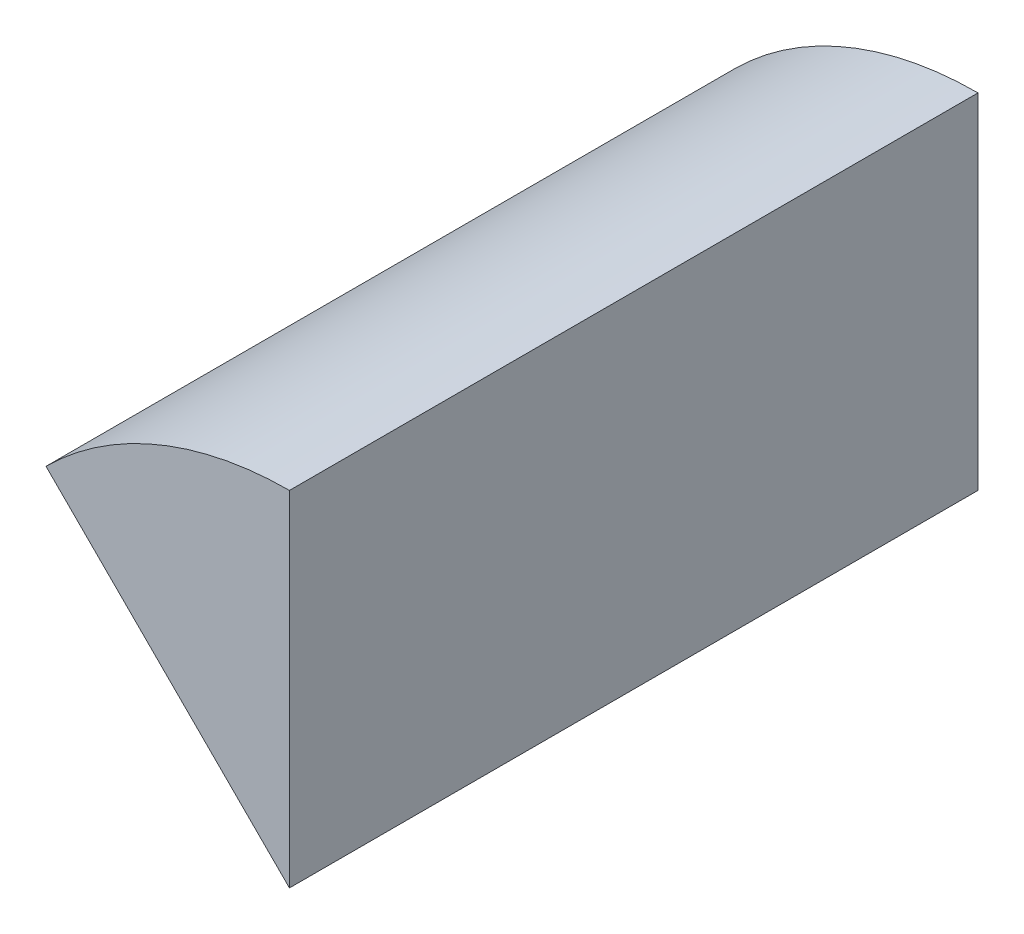
ISO-10303-21;
HEADER;
FILE_DESCRIPTION(('STEP AP214'),'2;1');
FILE_NAME('part.step','',(''),(''),'','','');
FILE_SCHEMA(('AUTOMOTIVE_DESIGN { 1 0 10303 214 1 1 1 1 }'));
ENDSEC;
DATA;
#1=APPLICATION_CONTEXT('core data for automotive mechanical design processes');
#2=APPLICATION_PROTOCOL_DEFINITION('international standard','automotive_design',2000,#1);
#3=PRODUCT_CONTEXT('',#1,'mechanical');
#4=PRODUCT('Part','Part','',(#3));
#5=PRODUCT_RELATED_PRODUCT_CATEGORY('part','',(#4));
#6=PRODUCT_DEFINITION_FORMATION('','',#4);
#7=PRODUCT_DEFINITION_CONTEXT('part definition',#1,'design');
#8=PRODUCT_DEFINITION('design','',#6,#7);
#9=PRODUCT_DEFINITION_SHAPE('','',#8);
#10=(LENGTH_UNIT() NAMED_UNIT(*) SI_UNIT(.MILLI.,.METRE.));
#11=(NAMED_UNIT(*) PLANE_ANGLE_UNIT() SI_UNIT($,.RADIAN.));
#12=(NAMED_UNIT(*) SI_UNIT($,.STERADIAN.) SOLID_ANGLE_UNIT());
#13=UNCERTAINTY_MEASURE_WITH_UNIT(LENGTH_MEASURE(1.E-05),#10,'distance_accuracy_value','');
#14=(GEOMETRIC_REPRESENTATION_CONTEXT(3) GLOBAL_UNCERTAINTY_ASSIGNED_CONTEXT((#13)) GLOBAL_UNIT_ASSIGNED_CONTEXT((#10,
#11,#12)) REPRESENTATION_CONTEXT('',''));
#15=CARTESIAN_POINT('',(0.,0.,0.));
#16=DIRECTION('',(0.,0.,1.));
#17=DIRECTION('',(1.,0.,0.));
#18=AXIS2_PLACEMENT_3D('',#15,#16,#17);
#19=CARTESIAN_POINT('',(0.,0.,50.));
#20=DIRECTION('',(0.707106781186544,0.707106781186551,0.));
#21=DIRECTION('',(-0.707106781186551,0.707106781186544,0.));
#22=AXIS2_PLACEMENT_3D('',#19,#20,#21);
#23=PLANE('',#22);
#24=DIRECTION('',(0.707106781186551,-0.707106781186544,0.));
#25=VECTOR('',#24,1.);
#26=CARTESIAN_POINT('',(0.,0.,0.));
#27=LINE('',#26,#25);
#28=CARTESIAN_POINT('',(-17.6776695296638,17.6776695296636,0.));
#29=VERTEX_POINT('',#28);
#30=CARTESIAN_POINT('',(0.,0.,0.));
#31=VERTEX_POINT('',#30);
#32=EDGE_CURVE('E80',#29,#31,#27,.T.);
#33=ORIENTED_EDGE('',*,*,#32,.T.);
#34=DIRECTION('',(0.,0.,-1.));
#35=VECTOR('',#34,1.);
#36=CARTESIAN_POINT('',(0.,0.,50.));
#37=LINE('',#36,#35);
#38=CARTESIAN_POINT('',(0.,0.,50.));
#39=VERTEX_POINT('',#38);
#40=EDGE_CURVE('E11',#39,#31,#37,.T.);
#41=ORIENTED_EDGE('',*,*,#40,.F.);
#42=DIRECTION('',(0.707106781186551,-0.707106781186544,0.));
#43=VECTOR('',#42,1.);
#44=CARTESIAN_POINT('',(0.,0.,50.));
#45=LINE('',#44,#43);
#46=CARTESIAN_POINT('',(-17.6776695296638,17.6776695296636,50.));
#47=VERTEX_POINT('',#46);
#48=EDGE_CURVE('E73',#47,#39,#45,.T.);
#49=ORIENTED_EDGE('',*,*,#48,.F.);
#50=DIRECTION('',(0.,0.,-1.));
#51=VECTOR('',#50,1.);
#52=CARTESIAN_POINT('',(-17.6776695296638,17.6776695296636,50.));
#53=LINE('',#52,#51);
#54=EDGE_CURVE('E81',#47,#29,#53,.T.);
#55=ORIENTED_EDGE('',*,*,#54,.T.);
#56=EDGE_LOOP('',(#33,#41,#49,#55));
#57=FACE_BOUND('',#56,.T.);
#58=ADVANCED_FACE('F33',(#57),#23,.F.);
#59=CARTESIAN_POINT('',(0.,25.,50.));
#60=DIRECTION('',(-1.,0.,0.));
#61=DIRECTION('',(0.,0.,1.));
#62=AXIS2_PLACEMENT_3D('',#59,#60,#61);
#63=PLANE('',#62);
#64=DIRECTION('',(0.,1.,0.));
#65=VECTOR('',#64,1.);
#66=CARTESIAN_POINT('',(0.,25.,0.));
#67=LINE('',#66,#65);
#68=CARTESIAN_POINT('',(0.,25.,0.));
#69=VERTEX_POINT('',#68);
#70=EDGE_CURVE('E61',#31,#69,#67,.T.);
#71=ORIENTED_EDGE('',*,*,#70,.T.);
#72=DIRECTION('',(0.,0.,-1.));
#73=VECTOR('',#72,1.);
#74=CARTESIAN_POINT('',(0.,25.,50.));
#75=LINE('',#74,#73);
#76=CARTESIAN_POINT('',(0.,25.,50.));
#77=VERTEX_POINT('',#76);
#78=EDGE_CURVE('E41',#77,#69,#75,.T.);
#79=ORIENTED_EDGE('',*,*,#78,.F.);
#80=DIRECTION('',(0.,1.,0.));
#81=VECTOR('',#80,1.);
#82=CARTESIAN_POINT('',(0.,25.,50.));
#83=LINE('',#82,#81);
#84=EDGE_CURVE('E69',#39,#77,#83,.T.);
#85=ORIENTED_EDGE('',*,*,#84,.F.);
#86=ORIENTED_EDGE('',*,*,#40,.T.);
#87=EDGE_LOOP('',(#71,#79,#85,#86));
#88=FACE_BOUND('',#87,.T.);
#89=ADVANCED_FACE('F70',(#88),#63,.F.);
#90=CARTESIAN_POINT('',(0.,0.,50.));
#91=DIRECTION('',(0.,0.,-1.));
#92=DIRECTION('',(-1.,0.,0.));
#93=AXIS2_PLACEMENT_3D('',#90,#91,#92);
#94=CYLINDRICAL_SURFACE('',#93,25.);
#95=CARTESIAN_POINT('',(0.,0.,0.));
#96=DIRECTION('',(0.,0.,1.));
#97=DIRECTION('',(1.,0.,0.));
#98=AXIS2_PLACEMENT_3D('',#95,#96,#97);
#99=CIRCLE('',#98,25.);
#100=EDGE_CURVE('E66',#69,#29,#99,.T.);
#101=ORIENTED_EDGE('',*,*,#100,.T.);
#102=ORIENTED_EDGE('',*,*,#54,.F.);
#103=CARTESIAN_POINT('',(0.,0.,50.));
#104=DIRECTION('',(0.,0.,1.));
#105=DIRECTION('',(1.,0.,0.));
#106=AXIS2_PLACEMENT_3D('',#103,#104,#105);
#107=CIRCLE('',#106,25.);
#108=EDGE_CURVE('E49',#77,#47,#107,.T.);
#109=ORIENTED_EDGE('',*,*,#108,.F.);
#110=ORIENTED_EDGE('',*,*,#78,.T.);
#111=EDGE_LOOP('',(#101,#102,#109,#110));
#112=FACE_BOUND('',#111,.T.);
#113=ADVANCED_FACE('F92',(#112),#94,.T.);
#114=CARTESIAN_POINT('',(0.,0.,50.));
#115=DIRECTION('',(0.,0.,1.));
#116=DIRECTION('',(1.,0.,0.));
#117=AXIS2_PLACEMENT_3D('',#114,#115,#116);
#118=PLANE('',#117);
#119=ORIENTED_EDGE('',*,*,#48,.T.);
#120=ORIENTED_EDGE('',*,*,#84,.T.);
#121=ORIENTED_EDGE('',*,*,#108,.T.);
#122=EDGE_LOOP('',(#119,#120,#121));
#123=FACE_BOUND('',#122,.T.);
#124=ADVANCED_FACE('F76',(#123),#118,.T.);
#125=CARTESIAN_POINT('',(0.,0.,0.));
#126=DIRECTION('',(0.,0.,1.));
#127=DIRECTION('',(1.,0.,0.));
#128=AXIS2_PLACEMENT_3D('',#125,#126,#127);
#129=PLANE('',#128);
#130=CARTESIAN_POINT('',(-6.59443802966832,16.741529423233,0.));
#131=DIRECTION('',(0.,0.,-1.));
#132=DIRECTION('',(-1.,0.,0.));
#133=AXIS2_PLACEMENT_3D('',#130,#131,#132);
#134=CIRCLE('',#133,5.);
#135=CARTESIAN_POINT('',(-11.5944380296683,16.741529423233,0.));
#136=VERTEX_POINT('',#135);
#137=EDGE_CURVE('E87',#136,#136,#134,.T.);
#138=ORIENTED_EDGE('',*,*,#137,.F.);
#139=EDGE_LOOP('',(#138));
#140=FACE_BOUND('',#139,.T.);
#141=ORIENTED_EDGE('',*,*,#32,.F.);
#142=ORIENTED_EDGE('',*,*,#100,.F.);
#143=ORIENTED_EDGE('',*,*,#70,.F.);
#144=EDGE_LOOP('',(#141,#142,#143));
#145=FACE_BOUND('',#144,.T.);
#146=ADVANCED_FACE('F93',(#140,#145),#129,.F.);
#147=CARTESIAN_POINT('',(-6.59443802966832,16.741529423233,10.));
#148=DIRECTION('',(0.,0.,-1.));
#149=DIRECTION('',(-1.,0.,0.));
#150=AXIS2_PLACEMENT_3D('',#147,#148,#149);
#151=CYLINDRICAL_SURFACE('',#150,5.);
#152=CARTESIAN_POINT('',(-6.59443802966832,16.741529423233,10.));
#153=DIRECTION('',(0.,0.,-1.));
#154=DIRECTION('',(-1.,0.,0.));
#155=AXIS2_PLACEMENT_3D('',#152,#153,#154);
#156=CIRCLE('',#155,5.);
#157=CARTESIAN_POINT('',(-11.5944380296683,16.741529423233,10.));
#158=VERTEX_POINT('',#157);
#159=EDGE_CURVE('E83',#158,#158,#156,.T.);
#160=ORIENTED_EDGE('',*,*,#159,.F.);
#161=EDGE_LOOP('',(#160));
#162=FACE_BOUND('',#161,.T.);
#163=ORIENTED_EDGE('',*,*,#137,.T.);
#164=EDGE_LOOP('',(#163));
#165=FACE_BOUND('',#164,.T.);
#166=ADVANCED_FACE('F95',(#162,#165),#151,.F.);
#167=CARTESIAN_POINT('',(-6.59443802966832,16.741529423233,10.));
#168=DIRECTION('',(0.,0.,-1.));
#169=DIRECTION('',(-1.,0.,0.));
#170=AXIS2_PLACEMENT_3D('',#167,#168,#169);
#171=PLANE('',#170);
#172=ORIENTED_EDGE('',*,*,#159,.T.);
#173=EDGE_LOOP('',(#172));
#174=FACE_BOUND('',#173,.T.);
#175=ADVANCED_FACE('F102',(#174),#171,.T.);
#176=CLOSED_SHELL('',(#58,#89,#113,#124,#146,#166,#175));
#177=MANIFOLD_SOLID_BREP('B2',#176);
#178=ADVANCED_BREP_SHAPE_REPRESENTATION('',(#18,#177),#14);
#179=SHAPE_DEFINITION_REPRESENTATION(#9,#178);
ENDSEC;
END-ISO-10303-21;
